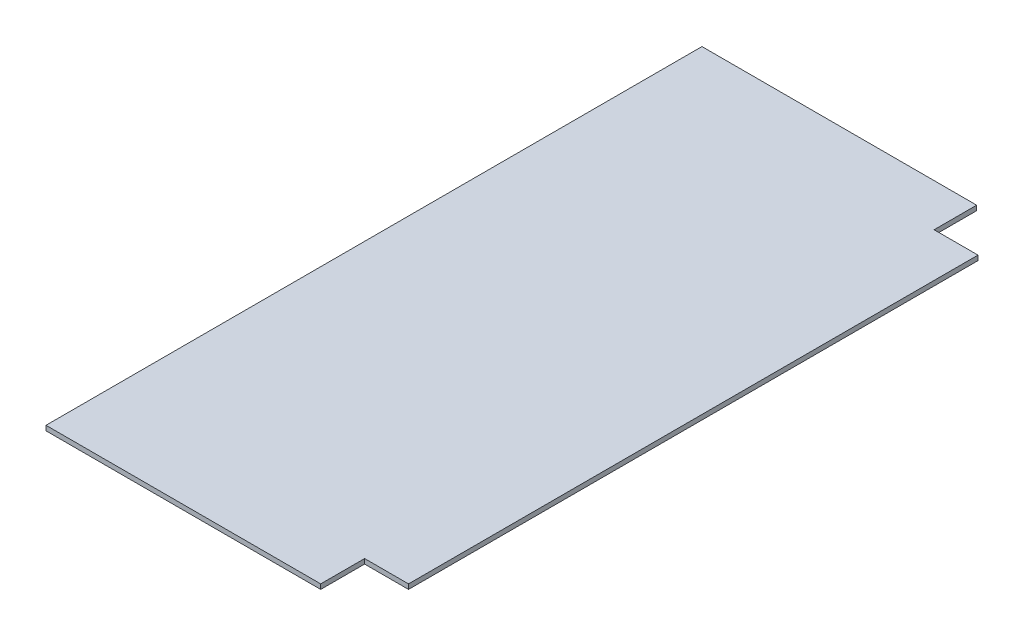
ISO-10303-21;
HEADER;
FILE_DESCRIPTION(('STEP AP214'),'2;1');
FILE_NAME('part.step','',(''),(''),'','','');
FILE_SCHEMA(('AUTOMOTIVE_DESIGN { 1 0 10303 214 1 1 1 1 }'));
ENDSEC;
DATA;
#1=APPLICATION_CONTEXT('core data for automotive mechanical design processes');
#2=APPLICATION_PROTOCOL_DEFINITION('international standard','automotive_design',2000,#1);
#3=PRODUCT_CONTEXT('',#1,'mechanical');
#4=PRODUCT('Part','Part','',(#3));
#5=PRODUCT_RELATED_PRODUCT_CATEGORY('part','',(#4));
#6=PRODUCT_DEFINITION_FORMATION('','',#4);
#7=PRODUCT_DEFINITION_CONTEXT('part definition',#1,'design');
#8=PRODUCT_DEFINITION('design','',#6,#7);
#9=PRODUCT_DEFINITION_SHAPE('','',#8);
#10=(LENGTH_UNIT() NAMED_UNIT(*) SI_UNIT(.MILLI.,.METRE.));
#11=(NAMED_UNIT(*) PLANE_ANGLE_UNIT() SI_UNIT($,.RADIAN.));
#12=(NAMED_UNIT(*) SI_UNIT($,.STERADIAN.) SOLID_ANGLE_UNIT());
#13=UNCERTAINTY_MEASURE_WITH_UNIT(LENGTH_MEASURE(1.E-05),#10,'distance_accuracy_value','');
#14=(GEOMETRIC_REPRESENTATION_CONTEXT(3) GLOBAL_UNCERTAINTY_ASSIGNED_CONTEXT((#13)) GLOBAL_UNIT_ASSIGNED_CONTEXT((#10,
#11,#12)) REPRESENTATION_CONTEXT('',''));
#15=CARTESIAN_POINT('',(0.,0.,0.));
#16=DIRECTION('',(0.,0.,1.));
#17=DIRECTION('',(1.,0.,0.));
#18=AXIS2_PLACEMENT_3D('',#15,#16,#17);
#19=CARTESIAN_POINT('',(0.,9.,612.5));
#20=DIRECTION('',(0.,0.,-1.));
#21=DIRECTION('',(-1.,0.,0.));
#22=AXIS2_PLACEMENT_3D('',#19,#20,#21);
#23=PLANE('',#22);
#24=DIRECTION('',(1.,0.,0.));
#25=VECTOR('',#24,1.);
#26=CARTESIAN_POINT('',(0.,0.,612.5));
#27=LINE('',#26,#25);
#28=CARTESIAN_POINT('',(-290.5,0.,612.5));
#29=VERTEX_POINT('',#28);
#30=CARTESIAN_POINT('',(222.5,0.,612.5));
#31=VERTEX_POINT('',#30);
#32=EDGE_CURVE('E134',#29,#31,#27,.T.);
#33=ORIENTED_EDGE('',*,*,#32,.T.);
#34=DIRECTION('',(0.,1.,0.));
#35=VECTOR('',#34,1.);
#36=CARTESIAN_POINT('',(222.5,-1.,612.5));
#37=LINE('',#36,#35);
#38=CARTESIAN_POINT('',(222.5,9.,612.5));
#39=VERTEX_POINT('',#38);
#40=EDGE_CURVE('E175',#31,#39,#37,.T.);
#41=ORIENTED_EDGE('',*,*,#40,.T.);
#42=DIRECTION('',(1.,0.,0.));
#43=VECTOR('',#42,1.);
#44=CARTESIAN_POINT('',(0.,9.,612.5));
#45=LINE('',#44,#43);
#46=CARTESIAN_POINT('',(-290.5,9.,612.5));
#47=VERTEX_POINT('',#46);
#48=EDGE_CURVE('E125',#47,#39,#45,.T.);
#49=ORIENTED_EDGE('',*,*,#48,.F.);
#50=DIRECTION('',(0.,1.,0.));
#51=VECTOR('',#50,1.);
#52=CARTESIAN_POINT('',(-290.5,-1.,612.5));
#53=LINE('',#52,#51);
#54=EDGE_CURVE('E138',#29,#47,#53,.T.);
#55=ORIENTED_EDGE('',*,*,#54,.F.);
#56=EDGE_LOOP('',(#33,#41,#49,#55));
#57=FACE_BOUND('',#56,.T.);
#58=ADVANCED_FACE('F41',(#57),#23,.F.);
#59=CARTESIAN_POINT('',(0.,9.,-612.5));
#60=DIRECTION('',(0.,0.,-1.));
#61=DIRECTION('',(-1.,0.,0.));
#62=AXIS2_PLACEMENT_3D('',#59,#60,#61);
#63=PLANE('',#62);
#64=DIRECTION('',(0.,1.,0.));
#65=VECTOR('',#64,1.);
#66=CARTESIAN_POINT('',(222.5,9.,-612.5));
#67=LINE('',#66,#65);
#68=CARTESIAN_POINT('',(222.5,0.,-612.5));
#69=VERTEX_POINT('',#68);
#70=CARTESIAN_POINT('',(222.5,9.,-612.5));
#71=VERTEX_POINT('',#70);
#72=EDGE_CURVE('E155',#69,#71,#67,.T.);
#73=ORIENTED_EDGE('',*,*,#72,.F.);
#74=DIRECTION('',(1.,0.,0.));
#75=VECTOR('',#74,1.);
#76=CARTESIAN_POINT('',(0.,0.,-612.5));
#77=LINE('',#76,#75);
#78=CARTESIAN_POINT('',(-290.5,0.,-612.5));
#79=VERTEX_POINT('',#78);
#80=EDGE_CURVE('E130',#79,#69,#77,.T.);
#81=ORIENTED_EDGE('',*,*,#80,.F.);
#82=DIRECTION('',(0.,1.,0.));
#83=VECTOR('',#82,1.);
#84=CARTESIAN_POINT('',(-290.5,-1.,-612.5));
#85=LINE('',#84,#83);
#86=CARTESIAN_POINT('',(-290.5,9.,-612.5));
#87=VERTEX_POINT('',#86);
#88=EDGE_CURVE('E165',#79,#87,#85,.T.);
#89=ORIENTED_EDGE('',*,*,#88,.T.);
#90=DIRECTION('',(1.,0.,0.));
#91=VECTOR('',#90,1.);
#92=CARTESIAN_POINT('',(0.,9.,-612.5));
#93=LINE('',#92,#91);
#94=EDGE_CURVE('E124',#87,#71,#93,.T.);
#95=ORIENTED_EDGE('',*,*,#94,.T.);
#96=EDGE_LOOP('',(#73,#81,#89,#95));
#97=FACE_BOUND('',#96,.T.);
#98=ADVANCED_FACE('F159',(#97),#63,.T.);
#99=CARTESIAN_POINT('',(0.,9.,0.));
#100=DIRECTION('',(0.,1.,0.));
#101=DIRECTION('',(0.,0.,1.));
#102=AXIS2_PLACEMENT_3D('',#99,#100,#101);
#103=PLANE('',#102);
#104=DIRECTION('',(0.,0.,1.));
#105=VECTOR('',#104,1.);
#106=CARTESIAN_POINT('',(222.5,9.,612.5));
#107=LINE('',#106,#105);
#108=CARTESIAN_POINT('',(222.5,9.,530.5));
#109=VERTEX_POINT('',#108);
#110=EDGE_CURVE('E120',#109,#39,#107,.T.);
#111=ORIENTED_EDGE('',*,*,#110,.F.);
#112=DIRECTION('',(-1.,0.,0.));
#113=VECTOR('',#112,1.);
#114=CARTESIAN_POINT('',(222.5,9.,530.5));
#115=LINE('',#114,#113);
#116=CARTESIAN_POINT('',(304.5,9.,530.5));
#117=VERTEX_POINT('',#116);
#118=EDGE_CURVE('E107',#117,#109,#115,.T.);
#119=ORIENTED_EDGE('',*,*,#118,.F.);
#120=DIRECTION('',(0.,0.,-1.));
#121=VECTOR('',#120,1.);
#122=CARTESIAN_POINT('',(304.5,9.,0.));
#123=LINE('',#122,#121);
#124=CARTESIAN_POINT('',(304.5,9.,-533.));
#125=VERTEX_POINT('',#124);
#126=EDGE_CURVE('E118',#117,#125,#123,.T.);
#127=ORIENTED_EDGE('',*,*,#126,.T.);
#128=DIRECTION('',(1.,0.,0.));
#129=VECTOR('',#128,1.);
#130=CARTESIAN_POINT('',(304.5,9.,-533.));
#131=LINE('',#130,#129);
#132=CARTESIAN_POINT('',(222.5,9.,-533.));
#133=VERTEX_POINT('',#132);
#134=EDGE_CURVE('E55',#133,#125,#131,.T.);
#135=ORIENTED_EDGE('',*,*,#134,.F.);
#136=DIRECTION('',(0.,0.,1.));
#137=VECTOR('',#136,1.);
#138=CARTESIAN_POINT('',(222.5,9.,-533.));
#139=LINE('',#138,#137);
#140=EDGE_CURVE('E121',#71,#133,#139,.T.);
#141=ORIENTED_EDGE('',*,*,#140,.F.);
#142=ORIENTED_EDGE('',*,*,#94,.F.);
#143=DIRECTION('',(0.,0.,1.));
#144=VECTOR('',#143,1.);
#145=CARTESIAN_POINT('',(-290.5,9.,0.));
#146=LINE('',#145,#144);
#147=EDGE_CURVE('E162',#87,#47,#146,.T.);
#148=ORIENTED_EDGE('',*,*,#147,.T.);
#149=ORIENTED_EDGE('',*,*,#48,.T.);
#150=EDGE_LOOP('',(#111,#119,#127,#135,#141,#142,#148,#149));
#151=FACE_BOUND('',#150,.T.);
#152=ADVANCED_FACE('F117',(#151),#103,.T.);
#153=CARTESIAN_POINT('',(0.,0.,0.));
#154=DIRECTION('',(0.,1.,0.));
#155=DIRECTION('',(0.,0.,1.));
#156=AXIS2_PLACEMENT_3D('',#153,#154,#155);
#157=PLANE('',#156);
#158=DIRECTION('',(-1.,0.,0.));
#159=VECTOR('',#158,1.);
#160=CARTESIAN_POINT('',(0.,0.,530.5));
#161=LINE('',#160,#159);
#162=CARTESIAN_POINT('',(304.5,0.,530.5));
#163=VERTEX_POINT('',#162);
#164=CARTESIAN_POINT('',(222.5,0.,530.5));
#165=VERTEX_POINT('',#164);
#166=EDGE_CURVE('E63',#163,#165,#161,.T.);
#167=ORIENTED_EDGE('',*,*,#166,.T.);
#168=DIRECTION('',(0.,0.,1.));
#169=VECTOR('',#168,1.);
#170=CARTESIAN_POINT('',(222.5,0.,0.));
#171=LINE('',#170,#169);
#172=EDGE_CURVE('E11',#165,#31,#171,.T.);
#173=ORIENTED_EDGE('',*,*,#172,.T.);
#174=ORIENTED_EDGE('',*,*,#32,.F.);
#175=DIRECTION('',(0.,0.,1.));
#176=VECTOR('',#175,1.);
#177=CARTESIAN_POINT('',(-290.5,0.,0.));
#178=LINE('',#177,#176);
#179=EDGE_CURVE('E128',#79,#29,#178,.T.);
#180=ORIENTED_EDGE('',*,*,#179,.F.);
#181=ORIENTED_EDGE('',*,*,#80,.T.);
#182=DIRECTION('',(0.,0.,1.));
#183=VECTOR('',#182,1.);
#184=CARTESIAN_POINT('',(222.5,0.,0.));
#185=LINE('',#184,#183);
#186=CARTESIAN_POINT('',(222.5,0.,-533.));
#187=VERTEX_POINT('',#186);
#188=EDGE_CURVE('E48',#69,#187,#185,.T.);
#189=ORIENTED_EDGE('',*,*,#188,.T.);
#190=DIRECTION('',(1.,0.,0.));
#191=VECTOR('',#190,1.);
#192=CARTESIAN_POINT('',(0.,0.,-533.));
#193=LINE('',#192,#191);
#194=CARTESIAN_POINT('',(304.5,0.,-533.));
#195=VERTEX_POINT('',#194);
#196=EDGE_CURVE('E147',#187,#195,#193,.T.);
#197=ORIENTED_EDGE('',*,*,#196,.T.);
#198=DIRECTION('',(0.,0.,-1.));
#199=VECTOR('',#198,1.);
#200=CARTESIAN_POINT('',(304.5,0.,0.));
#201=LINE('',#200,#199);
#202=EDGE_CURVE('E137',#163,#195,#201,.T.);
#203=ORIENTED_EDGE('',*,*,#202,.F.);
#204=EDGE_LOOP('',(#167,#173,#174,#180,#181,#189,#197,#203));
#205=FACE_BOUND('',#204,.T.);
#206=ADVANCED_FACE('F146',(#205),#157,.F.);
#207=CARTESIAN_POINT('',(304.5,9.,0.));
#208=DIRECTION('',(-1.,0.,0.));
#209=DIRECTION('',(0.,0.,1.));
#210=AXIS2_PLACEMENT_3D('',#207,#208,#209);
#211=PLANE('',#210);
#212=ORIENTED_EDGE('',*,*,#126,.F.);
#213=DIRECTION('',(0.,-1.,0.));
#214=VECTOR('',#213,1.);
#215=CARTESIAN_POINT('',(304.5,9.,530.5));
#216=LINE('',#215,#214);
#217=EDGE_CURVE('E104',#117,#163,#216,.T.);
#218=ORIENTED_EDGE('',*,*,#217,.T.);
#219=ORIENTED_EDGE('',*,*,#202,.T.);
#220=DIRECTION('',(0.,1.,0.));
#221=VECTOR('',#220,1.);
#222=CARTESIAN_POINT('',(304.5,9.,-533.));
#223=LINE('',#222,#221);
#224=EDGE_CURVE('E113',#195,#125,#223,.T.);
#225=ORIENTED_EDGE('',*,*,#224,.T.);
#226=EDGE_LOOP('',(#212,#218,#219,#225));
#227=FACE_BOUND('',#226,.T.);
#228=ADVANCED_FACE('F123',(#227),#211,.F.);
#229=CARTESIAN_POINT('',(-290.5,-1.,0.));
#230=DIRECTION('',(-1.,0.,0.));
#231=DIRECTION('',(0.,0.,1.));
#232=AXIS2_PLACEMENT_3D('',#229,#230,#231);
#233=PLANE('',#232);
#234=ORIENTED_EDGE('',*,*,#179,.T.);
#235=ORIENTED_EDGE('',*,*,#54,.T.);
#236=ORIENTED_EDGE('',*,*,#147,.F.);
#237=ORIENTED_EDGE('',*,*,#88,.F.);
#238=EDGE_LOOP('',(#234,#235,#236,#237));
#239=FACE_BOUND('',#238,.T.);
#240=ADVANCED_FACE('F184',(#239),#233,.T.);
#241=CARTESIAN_POINT('',(304.5,-1.,-533.));
#242=DIRECTION('',(0.,0.,1.));
#243=DIRECTION('',(1.,0.,0.));
#244=AXIS2_PLACEMENT_3D('',#241,#242,#243);
#245=PLANE('',#244);
#246=DIRECTION('',(0.,1.,0.));
#247=VECTOR('',#246,1.);
#248=CARTESIAN_POINT('',(222.5,-1.,-533.));
#249=LINE('',#248,#247);
#250=EDGE_CURVE('E157',#187,#133,#249,.T.);
#251=ORIENTED_EDGE('',*,*,#250,.T.);
#252=ORIENTED_EDGE('',*,*,#134,.T.);
#253=ORIENTED_EDGE('',*,*,#224,.F.);
#254=ORIENTED_EDGE('',*,*,#196,.F.);
#255=EDGE_LOOP('',(#251,#252,#253,#254));
#256=FACE_BOUND('',#255,.T.);
#257=ADVANCED_FACE('F182',(#256),#245,.F.);
#258=CARTESIAN_POINT('',(222.5,-1.,-533.));
#259=DIRECTION('',(-1.,0.,0.));
#260=DIRECTION('',(0.,0.,1.));
#261=AXIS2_PLACEMENT_3D('',#258,#259,#260);
#262=PLANE('',#261);
#263=ORIENTED_EDGE('',*,*,#72,.T.);
#264=ORIENTED_EDGE('',*,*,#140,.T.);
#265=ORIENTED_EDGE('',*,*,#250,.F.);
#266=ORIENTED_EDGE('',*,*,#188,.F.);
#267=EDGE_LOOP('',(#263,#264,#265,#266));
#268=FACE_BOUND('',#267,.T.);
#269=ADVANCED_FACE('F153',(#268),#262,.F.);
#270=CARTESIAN_POINT('',(222.5,-1.,612.5));
#271=DIRECTION('',(-1.,0.,0.));
#272=DIRECTION('',(0.,0.,1.));
#273=AXIS2_PLACEMENT_3D('',#270,#271,#272);
#274=PLANE('',#273);
#275=DIRECTION('',(0.,1.,0.));
#276=VECTOR('',#275,1.);
#277=CARTESIAN_POINT('',(222.5,-1.,530.5));
#278=LINE('',#277,#276);
#279=EDGE_CURVE('E177',#165,#109,#278,.T.);
#280=ORIENTED_EDGE('',*,*,#279,.T.);
#281=ORIENTED_EDGE('',*,*,#110,.T.);
#282=ORIENTED_EDGE('',*,*,#40,.F.);
#283=ORIENTED_EDGE('',*,*,#172,.F.);
#284=EDGE_LOOP('',(#280,#281,#282,#283));
#285=FACE_BOUND('',#284,.T.);
#286=ADVANCED_FACE('F190',(#285),#274,.F.);
#287=CARTESIAN_POINT('',(222.5,-1.,530.5));
#288=DIRECTION('',(0.,0.,-1.));
#289=DIRECTION('',(-1.,0.,0.));
#290=AXIS2_PLACEMENT_3D('',#287,#288,#289);
#291=PLANE('',#290);
#292=ORIENTED_EDGE('',*,*,#217,.F.);
#293=ORIENTED_EDGE('',*,*,#118,.T.);
#294=ORIENTED_EDGE('',*,*,#279,.F.);
#295=ORIENTED_EDGE('',*,*,#166,.F.);
#296=EDGE_LOOP('',(#292,#293,#294,#295));
#297=FACE_BOUND('',#296,.T.);
#298=ADVANCED_FACE('F106',(#297),#291,.F.);
#299=CLOSED_SHELL('',(#58,#98,#152,#206,#228,#240,#257,#269,#286,#298));
#300=MANIFOLD_SOLID_BREP('B2',#299);
#301=ADVANCED_BREP_SHAPE_REPRESENTATION('',(#18,#300),#14);
#302=SHAPE_DEFINITION_REPRESENTATION(#9,#301);
ENDSEC;
END-ISO-10303-21;
